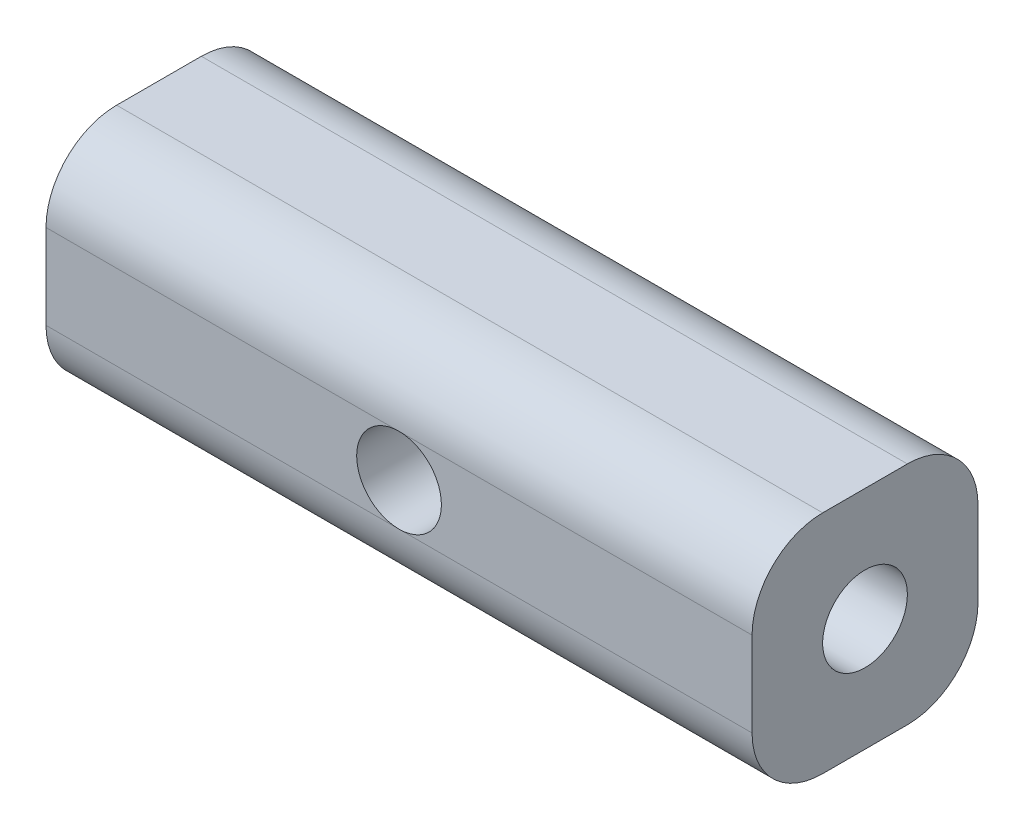
ISO-10303-21;
HEADER;
FILE_DESCRIPTION(('STEP AP214'),'2;1');
FILE_NAME('part.step','',(''),(''),'','','');
FILE_SCHEMA(('AUTOMOTIVE_DESIGN { 1 0 10303 214 1 1 1 1 }'));
ENDSEC;
DATA;
#1=APPLICATION_CONTEXT('core data for automotive mechanical design processes');
#2=APPLICATION_PROTOCOL_DEFINITION('international standard','automotive_design',2000,#1);
#3=PRODUCT_CONTEXT('',#1,'mechanical');
#4=PRODUCT('Part','Part','',(#3));
#5=PRODUCT_RELATED_PRODUCT_CATEGORY('part','',(#4));
#6=PRODUCT_DEFINITION_FORMATION('','',#4);
#7=PRODUCT_DEFINITION_CONTEXT('part definition',#1,'design');
#8=PRODUCT_DEFINITION('design','',#6,#7);
#9=PRODUCT_DEFINITION_SHAPE('','',#8);
#10=(LENGTH_UNIT() NAMED_UNIT(*) SI_UNIT(.MILLI.,.METRE.));
#11=(NAMED_UNIT(*) PLANE_ANGLE_UNIT() SI_UNIT($,.RADIAN.));
#12=(NAMED_UNIT(*) SI_UNIT($,.STERADIAN.) SOLID_ANGLE_UNIT());
#13=UNCERTAINTY_MEASURE_WITH_UNIT(LENGTH_MEASURE(1.E-05),#10,'distance_accuracy_value','');
#14=(GEOMETRIC_REPRESENTATION_CONTEXT(3) GLOBAL_UNCERTAINTY_ASSIGNED_CONTEXT((#13)) GLOBAL_UNIT_ASSIGNED_CONTEXT((#10,
#11,#12)) REPRESENTATION_CONTEXT('',''));
#15=CARTESIAN_POINT('',(0.,0.,0.));
#16=DIRECTION('',(0.,0.,1.));
#17=DIRECTION('',(1.,0.,0.));
#18=AXIS2_PLACEMENT_3D('',#15,#16,#17);
#19=CARTESIAN_POINT('',(0.,0.,80.));
#20=DIRECTION('',(0.,0.,-1.));
#21=DIRECTION('',(-1.,0.,0.));
#22=AXIS2_PLACEMENT_3D('',#19,#20,#21);
#23=PLANE('',#22);
#24=DIRECTION('',(0.,-1.,0.));
#25=VECTOR('',#24,1.);
#26=CARTESIAN_POINT('',(0.,0.,80.));
#27=LINE('',#26,#25);
#28=CARTESIAN_POINT('',(0.,55.,80.));
#29=VERTEX_POINT('',#28);
#30=CARTESIAN_POINT('',(0.,25.,80.));
#31=VERTEX_POINT('',#30);
#32=EDGE_CURVE('E191',#29,#31,#27,.T.);
#33=ORIENTED_EDGE('',*,*,#32,.T.);
#34=DIRECTION('',(1.,0.,0.));
#35=VECTOR('',#34,1.);
#36=CARTESIAN_POINT('',(0.,25.,80.));
#37=LINE('',#36,#35);
#38=CARTESIAN_POINT('',(125.,25.,80.));
#39=VERTEX_POINT('',#38);
#40=EDGE_CURVE('E11',#31,#39,#37,.T.);
#41=ORIENTED_EDGE('',*,*,#40,.T.);
#42=CARTESIAN_POINT('',(125.,40.,80.));
#43=DIRECTION('',(0.,0.,1.));
#44=DIRECTION('',(1.,0.,0.));
#45=AXIS2_PLACEMENT_3D('',#42,#43,#44);
#46=CIRCLE('',#45,15.);
#47=CARTESIAN_POINT('',(125.,55.,80.));
#48=VERTEX_POINT('',#47);
#49=EDGE_CURVE('E228',#48,#39,#46,.T.);
#50=ORIENTED_EDGE('',*,*,#49,.F.);
#51=DIRECTION('',(-1.,0.,0.));
#52=VECTOR('',#51,1.);
#53=CARTESIAN_POINT('',(0.,55.,80.));
#54=LINE('',#53,#52);
#55=EDGE_CURVE('E54',#48,#29,#54,.T.);
#56=ORIENTED_EDGE('',*,*,#55,.T.);
#57=EDGE_LOOP('',(#33,#41,#50,#56));
#58=FACE_BOUND('',#57,.T.);
#59=ADVANCED_FACE('F33',(#58),#23,.F.);
#60=CARTESIAN_POINT('',(0.,0.,0.));
#61=DIRECTION('',(0.,0.,-1.));
#62=DIRECTION('',(-1.,0.,0.));
#63=AXIS2_PLACEMENT_3D('',#60,#61,#62);
#64=PLANE('',#63);
#65=DIRECTION('',(0.,-1.,0.));
#66=VECTOR('',#65,1.);
#67=CARTESIAN_POINT('',(0.,0.,0.));
#68=LINE('',#67,#66);
#69=CARTESIAN_POINT('',(0.,55.,0.));
#70=VERTEX_POINT('',#69);
#71=CARTESIAN_POINT('',(0.,25.,0.));
#72=VERTEX_POINT('',#71);
#73=EDGE_CURVE('E218',#70,#72,#68,.T.);
#74=ORIENTED_EDGE('',*,*,#73,.F.);
#75=DIRECTION('',(-1.,0.,0.));
#76=VECTOR('',#75,1.);
#77=CARTESIAN_POINT('',(250.,55.,0.));
#78=LINE('',#77,#76);
#79=CARTESIAN_POINT('',(125.,55.,0.));
#80=VERTEX_POINT('',#79);
#81=EDGE_CURVE('E157',#70,#80,#78,.F.);
#82=ORIENTED_EDGE('',*,*,#81,.T.);
#83=CARTESIAN_POINT('',(125.,40.,0.));
#84=DIRECTION('',(0.,0.,1.));
#85=DIRECTION('',(1.,0.,0.));
#86=AXIS2_PLACEMENT_3D('',#83,#84,#85);
#87=CIRCLE('',#86,15.);
#88=CARTESIAN_POINT('',(125.,25.,0.));
#89=VERTEX_POINT('',#88);
#90=EDGE_CURVE('E225',#80,#89,#87,.T.);
#91=ORIENTED_EDGE('',*,*,#90,.T.);
#92=DIRECTION('',(1.,0.,0.));
#93=VECTOR('',#92,1.);
#94=CARTESIAN_POINT('',(0.,25.,0.));
#95=LINE('',#94,#93);
#96=EDGE_CURVE('E151',#89,#72,#95,.F.);
#97=ORIENTED_EDGE('',*,*,#96,.T.);
#98=EDGE_LOOP('',(#74,#82,#91,#97));
#99=FACE_BOUND('',#98,.T.);
#100=ADVANCED_FACE('F256',(#99),#64,.T.);
#101=CARTESIAN_POINT('',(0.,40.,40.));
#102=DIRECTION('',(1.,0.,0.));
#103=DIRECTION('',(0.,0.,-1.));
#104=AXIS2_PLACEMENT_3D('',#101,#102,#103);
#105=CYLINDRICAL_SURFACE('',#104,15.);
#106=CARTESIAN_POINT('',(250.,40.,40.));
#107=DIRECTION('',(1.,0.,0.));
#108=DIRECTION('',(0.,0.,-1.));
#109=AXIS2_PLACEMENT_3D('',#106,#107,#108);
#110=CIRCLE('',#109,15.);
#111=CARTESIAN_POINT('',(250.,40.,25.));
#112=VERTEX_POINT('',#111);
#113=EDGE_CURVE('E222',#112,#112,#110,.T.);
#114=ORIENTED_EDGE('',*,*,#113,.T.);
#115=EDGE_LOOP('',(#114));
#116=FACE_BOUND('',#115,.T.);
#117=CARTESIAN_POINT('',(125.,40.,40.));
#118=DIRECTION('',(0.707106781186547,0.,-0.707106781186547));
#119=DIRECTION('',(0.707106781186547,0.,0.707106781186547));
#120=AXIS2_PLACEMENT_3D('',#117,#118,#119);
#121=ELLIPSE('',#120,21.2132034355964,15.);
#122=CARTESIAN_POINT('',(125.,25.,40.));
#123=VERTEX_POINT('',#122);
#124=CARTESIAN_POINT('',(125.,55.,40.));
#125=VERTEX_POINT('',#124);
#126=EDGE_CURVE('E124',#123,#125,#121,.F.);
#127=ORIENTED_EDGE('',*,*,#126,.T.);
#128=CARTESIAN_POINT('',(125.,40.,40.));
#129=DIRECTION('',(0.707106781186547,0.,0.707106781186547));
#130=DIRECTION('',(0.707106781186547,0.,-0.707106781186547));
#131=AXIS2_PLACEMENT_3D('',#128,#129,#130);
#132=ELLIPSE('',#131,21.2132034355964,15.);
#133=EDGE_CURVE('E120',#125,#123,#132,.F.);
#134=ORIENTED_EDGE('',*,*,#133,.T.);
#135=EDGE_LOOP('',(#127,#134));
#136=FACE_BOUND('',#135,.T.);
#137=ADVANCED_FACE('F132',(#116,#136),#105,.F.);
#138=CARTESIAN_POINT('',(0.,0.,80.));
#139=DIRECTION('',(1.,0.,0.));
#140=DIRECTION('',(0.,0.,-1.));
#141=AXIS2_PLACEMENT_3D('',#138,#139,#140);
#142=PLANE('',#141);
#143=CARTESIAN_POINT('',(0.,40.,40.));
#144=DIRECTION('',(1.,0.,0.));
#145=DIRECTION('',(0.,0.,-1.));
#146=AXIS2_PLACEMENT_3D('',#143,#144,#145);
#147=CIRCLE('',#146,15.);
#148=CARTESIAN_POINT('',(0.,40.,25.));
#149=VERTEX_POINT('',#148);
#150=EDGE_CURVE('E219',#149,#149,#147,.T.);
#151=ORIENTED_EDGE('',*,*,#150,.T.);
#152=EDGE_LOOP('',(#151));
#153=FACE_BOUND('',#152,.T.);
#154=DIRECTION('',(0.,0.,-1.));
#155=VECTOR('',#154,1.);
#156=CARTESIAN_POINT('',(0.,80.,80.));
#157=LINE('',#156,#155);
#158=CARTESIAN_POINT('',(0.,80.,55.));
#159=VERTEX_POINT('',#158);
#160=CARTESIAN_POINT('',(0.,80.,25.));
#161=VERTEX_POINT('',#160);
#162=EDGE_CURVE('E190',#159,#161,#157,.T.);
#163=ORIENTED_EDGE('',*,*,#162,.T.);
#164=CARTESIAN_POINT('',(0.,55.,25.));
#165=DIRECTION('',(1.,0.,0.));
#166=DIRECTION('',(0.,0.,-1.));
#167=AXIS2_PLACEMENT_3D('',#164,#165,#166);
#168=CIRCLE('',#167,25.);
#169=EDGE_CURVE('E149',#161,#70,#168,.F.);
#170=ORIENTED_EDGE('',*,*,#169,.T.);
#171=ORIENTED_EDGE('',*,*,#73,.T.);
#172=CARTESIAN_POINT('',(0.,25.,25.));
#173=DIRECTION('',(1.,0.,0.));
#174=DIRECTION('',(0.,0.,-1.));
#175=AXIS2_PLACEMENT_3D('',#172,#173,#174);
#176=CIRCLE('',#175,25.);
#177=CARTESIAN_POINT('',(0.,0.,25.));
#178=VERTEX_POINT('',#177);
#179=EDGE_CURVE('E147',#72,#178,#176,.F.);
#180=ORIENTED_EDGE('',*,*,#179,.T.);
#181=DIRECTION('',(0.,0.,-1.));
#182=VECTOR('',#181,1.);
#183=CARTESIAN_POINT('',(0.,0.,80.));
#184=LINE('',#183,#182);
#185=CARTESIAN_POINT('',(0.,0.,55.));
#186=VERTEX_POINT('',#185);
#187=EDGE_CURVE('E130',#186,#178,#184,.T.);
#188=ORIENTED_EDGE('',*,*,#187,.F.);
#189=CARTESIAN_POINT('',(0.,25.,55.));
#190=DIRECTION('',(1.,0.,0.));
#191=DIRECTION('',(0.,0.,-1.));
#192=AXIS2_PLACEMENT_3D('',#189,#190,#191);
#193=CIRCLE('',#192,25.);
#194=EDGE_CURVE('E145',#186,#31,#193,.F.);
#195=ORIENTED_EDGE('',*,*,#194,.T.);
#196=ORIENTED_EDGE('',*,*,#32,.F.);
#197=CARTESIAN_POINT('',(0.,55.,55.));
#198=DIRECTION('',(1.,0.,0.));
#199=DIRECTION('',(0.,0.,-1.));
#200=AXIS2_PLACEMENT_3D('',#197,#198,#199);
#201=CIRCLE('',#200,25.);
#202=EDGE_CURVE('E143',#29,#159,#201,.F.);
#203=ORIENTED_EDGE('',*,*,#202,.T.);
#204=EDGE_LOOP('',(#163,#170,#171,#180,#188,#195,#196,#203));
#205=FACE_BOUND('',#204,.T.);
#206=ADVANCED_FACE('F204',(#153,#205),#142,.F.);
#207=CARTESIAN_POINT('',(0.,0.,80.));
#208=DIRECTION('',(0.,1.,0.));
#209=DIRECTION('',(0.,0.,1.));
#210=AXIS2_PLACEMENT_3D('',#207,#208,#209);
#211=PLANE('',#210);
#212=ORIENTED_EDGE('',*,*,#187,.T.);
#213=DIRECTION('',(1.,0.,0.));
#214=VECTOR('',#213,1.);
#215=CARTESIAN_POINT('',(250.,0.,25.));
#216=LINE('',#215,#214);
#217=CARTESIAN_POINT('',(250.,0.,25.));
#218=VERTEX_POINT('',#217);
#219=EDGE_CURVE('E169',#178,#218,#216,.T.);
#220=ORIENTED_EDGE('',*,*,#219,.T.);
#221=DIRECTION('',(0.,0.,-1.));
#222=VECTOR('',#221,1.);
#223=CARTESIAN_POINT('',(250.,0.,80.));
#224=LINE('',#223,#222);
#225=CARTESIAN_POINT('',(250.,0.,55.));
#226=VERTEX_POINT('',#225);
#227=EDGE_CURVE('E201',#226,#218,#224,.T.);
#228=ORIENTED_EDGE('',*,*,#227,.F.);
#229=DIRECTION('',(1.,0.,0.));
#230=VECTOR('',#229,1.);
#231=CARTESIAN_POINT('',(0.,0.,55.));
#232=LINE('',#231,#230);
#233=EDGE_CURVE('E167',#226,#186,#232,.F.);
#234=ORIENTED_EDGE('',*,*,#233,.T.);
#235=EDGE_LOOP('',(#212,#220,#228,#234));
#236=FACE_BOUND('',#235,.T.);
#237=ADVANCED_FACE('F199',(#236),#211,.F.);
#238=CARTESIAN_POINT('',(250.,0.,80.));
#239=DIRECTION('',(-1.,0.,0.));
#240=DIRECTION('',(0.,0.,1.));
#241=AXIS2_PLACEMENT_3D('',#238,#239,#240);
#242=PLANE('',#241);
#243=ORIENTED_EDGE('',*,*,#113,.F.);
#244=EDGE_LOOP('',(#243));
#245=FACE_BOUND('',#244,.T.);
#246=DIRECTION('',(0.,1.,0.));
#247=VECTOR('',#246,1.);
#248=CARTESIAN_POINT('',(250.,0.,0.));
#249=LINE('',#248,#247);
#250=CARTESIAN_POINT('',(250.,25.,0.));
#251=VERTEX_POINT('',#250);
#252=CARTESIAN_POINT('',(250.,55.,0.));
#253=VERTEX_POINT('',#252);
#254=EDGE_CURVE('E216',#251,#253,#249,.T.);
#255=ORIENTED_EDGE('',*,*,#254,.T.);
#256=CARTESIAN_POINT('',(250.,55.,25.));
#257=DIRECTION('',(-1.,0.,0.));
#258=DIRECTION('',(0.,0.,1.));
#259=AXIS2_PLACEMENT_3D('',#256,#257,#258);
#260=CIRCLE('',#259,25.);
#261=CARTESIAN_POINT('',(250.,80.,25.));
#262=VERTEX_POINT('',#261);
#263=EDGE_CURVE('E165',#253,#262,#260,.F.);
#264=ORIENTED_EDGE('',*,*,#263,.T.);
#265=DIRECTION('',(0.,0.,-1.));
#266=VECTOR('',#265,1.);
#267=CARTESIAN_POINT('',(250.,80.,80.));
#268=LINE('',#267,#266);
#269=CARTESIAN_POINT('',(250.,80.,55.));
#270=VERTEX_POINT('',#269);
#271=EDGE_CURVE('E210',#270,#262,#268,.T.);
#272=ORIENTED_EDGE('',*,*,#271,.F.);
#273=CARTESIAN_POINT('',(250.,55.,55.));
#274=DIRECTION('',(-1.,0.,0.));
#275=DIRECTION('',(0.,0.,1.));
#276=AXIS2_PLACEMENT_3D('',#273,#274,#275);
#277=CIRCLE('',#276,25.);
#278=CARTESIAN_POINT('',(250.,55.,80.));
#279=VERTEX_POINT('',#278);
#280=EDGE_CURVE('E159',#270,#279,#277,.F.);
#281=ORIENTED_EDGE('',*,*,#280,.T.);
#282=DIRECTION('',(0.,1.,0.));
#283=VECTOR('',#282,1.);
#284=CARTESIAN_POINT('',(250.,0.,80.));
#285=LINE('',#284,#283);
#286=CARTESIAN_POINT('',(250.,25.,80.));
#287=VERTEX_POINT('',#286);
#288=EDGE_CURVE('E179',#287,#279,#285,.T.);
#289=ORIENTED_EDGE('',*,*,#288,.F.);
#290=CARTESIAN_POINT('',(250.,25.,55.));
#291=DIRECTION('',(-1.,0.,0.));
#292=DIRECTION('',(0.,0.,1.));
#293=AXIS2_PLACEMENT_3D('',#290,#291,#292);
#294=CIRCLE('',#293,25.);
#295=EDGE_CURVE('E161',#287,#226,#294,.F.);
#296=ORIENTED_EDGE('',*,*,#295,.T.);
#297=ORIENTED_EDGE('',*,*,#227,.T.);
#298=CARTESIAN_POINT('',(250.,25.,25.));
#299=DIRECTION('',(-1.,0.,0.));
#300=DIRECTION('',(0.,0.,1.));
#301=AXIS2_PLACEMENT_3D('',#298,#299,#300);
#302=CIRCLE('',#301,25.);
#303=EDGE_CURVE('E163',#218,#251,#302,.F.);
#304=ORIENTED_EDGE('',*,*,#303,.T.);
#305=EDGE_LOOP('',(#255,#264,#272,#281,#289,#296,#297,#304));
#306=FACE_BOUND('',#305,.T.);
#307=ADVANCED_FACE('F185',(#245,#306),#242,.F.);
#308=CARTESIAN_POINT('',(0.,80.,80.));
#309=DIRECTION('',(0.,-1.,0.));
#310=DIRECTION('',(0.,0.,-1.));
#311=AXIS2_PLACEMENT_3D('',#308,#309,#310);
#312=PLANE('',#311);
#313=ORIENTED_EDGE('',*,*,#271,.T.);
#314=DIRECTION('',(-1.,0.,0.));
#315=VECTOR('',#314,1.);
#316=CARTESIAN_POINT('',(0.,80.,25.));
#317=LINE('',#316,#315);
#318=EDGE_CURVE('E140',#262,#161,#317,.T.);
#319=ORIENTED_EDGE('',*,*,#318,.T.);
#320=ORIENTED_EDGE('',*,*,#162,.F.);
#321=DIRECTION('',(-1.,0.,0.));
#322=VECTOR('',#321,1.);
#323=CARTESIAN_POINT('',(0.,80.,55.));
#324=LINE('',#323,#322);
#325=EDGE_CURVE('E133',#159,#270,#324,.F.);
#326=ORIENTED_EDGE('',*,*,#325,.T.);
#327=EDGE_LOOP('',(#313,#319,#320,#326));
#328=FACE_BOUND('',#327,.T.);
#329=ADVANCED_FACE('F249',(#328),#312,.F.);
#330=EDGE_CURVE('E181',#39,#48,#46,.T.);
#331=ORIENTED_EDGE('',*,*,#330,.F.);
#332=DIRECTION('',(1.,0.,0.));
#333=VECTOR('',#332,1.);
#334=CARTESIAN_POINT('',(0.,25.,80.));
#335=LINE('',#334,#333);
#336=EDGE_CURVE('E41',#39,#287,#335,.T.);
#337=ORIENTED_EDGE('',*,*,#336,.T.);
#338=ORIENTED_EDGE('',*,*,#288,.T.);
#339=DIRECTION('',(-1.,0.,0.));
#340=VECTOR('',#339,1.);
#341=CARTESIAN_POINT('',(0.,55.,80.));
#342=LINE('',#341,#340);
#343=EDGE_CURVE('E173',#279,#48,#342,.T.);
#344=ORIENTED_EDGE('',*,*,#343,.T.);
#345=EDGE_LOOP('',(#331,#337,#338,#344));
#346=FACE_BOUND('',#345,.T.);
#347=ADVANCED_FACE('F178',(#346),#23,.F.);
#348=EDGE_CURVE('E230',#89,#80,#87,.T.);
#349=ORIENTED_EDGE('',*,*,#348,.T.);
#350=DIRECTION('',(-1.,0.,0.));
#351=VECTOR('',#350,1.);
#352=CARTESIAN_POINT('',(250.,55.,0.));
#353=LINE('',#352,#351);
#354=EDGE_CURVE('E155',#80,#253,#353,.F.);
#355=ORIENTED_EDGE('',*,*,#354,.T.);
#356=ORIENTED_EDGE('',*,*,#254,.F.);
#357=DIRECTION('',(1.,0.,0.));
#358=VECTOR('',#357,1.);
#359=CARTESIAN_POINT('',(0.,25.,0.));
#360=LINE('',#359,#358);
#361=EDGE_CURVE('E153',#251,#89,#360,.F.);
#362=ORIENTED_EDGE('',*,*,#361,.T.);
#363=EDGE_LOOP('',(#349,#355,#356,#362));
#364=FACE_BOUND('',#363,.T.);
#365=ADVANCED_FACE('F238',(#364),#64,.T.);
#366=CARTESIAN_POINT('',(125.,40.,40.));
#367=DIRECTION('',(0.707106781186547,0.,-0.707106781186547));
#368=DIRECTION('',(0.707106781186547,0.,0.707106781186547));
#369=AXIS2_PLACEMENT_3D('',#366,#367,#368);
#370=ELLIPSE('',#369,21.2132034355964,15.);
#371=EDGE_CURVE('E116',#123,#125,#370,.T.);
#372=ORIENTED_EDGE('',*,*,#371,.T.);
#373=CARTESIAN_POINT('',(125.,40.,40.));
#374=DIRECTION('',(0.707106781186547,0.,0.707106781186547));
#375=DIRECTION('',(0.707106781186547,0.,-0.707106781186547));
#376=AXIS2_PLACEMENT_3D('',#373,#374,#375);
#377=ELLIPSE('',#376,21.2132034355964,15.);
#378=EDGE_CURVE('E123',#125,#123,#377,.T.);
#379=ORIENTED_EDGE('',*,*,#378,.T.);
#380=EDGE_LOOP('',(#372,#379));
#381=FACE_BOUND('',#380,.T.);
#382=ORIENTED_EDGE('',*,*,#150,.F.);
#383=EDGE_LOOP('',(#382));
#384=FACE_BOUND('',#383,.T.);
#385=ADVANCED_FACE('F135',(#381,#384),#105,.F.);
#386=CARTESIAN_POINT('',(125.,40.,0.));
#387=DIRECTION('',(0.,0.,1.));
#388=DIRECTION('',(1.,0.,0.));
#389=AXIS2_PLACEMENT_3D('',#386,#387,#388);
#390=CYLINDRICAL_SURFACE('',#389,15.);
#391=ORIENTED_EDGE('',*,*,#49,.T.);
#392=ORIENTED_EDGE('',*,*,#330,.T.);
#393=EDGE_LOOP('',(#391,#392));
#394=FACE_BOUND('',#393,.T.);
#395=ORIENTED_EDGE('',*,*,#126,.F.);
#396=ORIENTED_EDGE('',*,*,#378,.F.);
#397=EDGE_LOOP('',(#395,#396));
#398=FACE_BOUND('',#397,.T.);
#399=ADVANCED_FACE('F128',(#394,#398),#390,.F.);
#400=ORIENTED_EDGE('',*,*,#90,.F.);
#401=ORIENTED_EDGE('',*,*,#348,.F.);
#402=EDGE_LOOP('',(#400,#401));
#403=FACE_BOUND('',#402,.T.);
#404=ORIENTED_EDGE('',*,*,#371,.F.);
#405=ORIENTED_EDGE('',*,*,#133,.F.);
#406=EDGE_LOOP('',(#404,#405));
#407=FACE_BOUND('',#406,.T.);
#408=ADVANCED_FACE('F118',(#403,#407),#390,.F.);
#409=CARTESIAN_POINT('',(0.,55.,25.));
#410=DIRECTION('',(1.,0.,0.));
#411=DIRECTION('',(0.,0.,-1.));
#412=AXIS2_PLACEMENT_3D('',#409,#410,#411);
#413=CYLINDRICAL_SURFACE('',#412,25.);
#414=ORIENTED_EDGE('',*,*,#354,.F.);
#415=ORIENTED_EDGE('',*,*,#81,.F.);
#416=ORIENTED_EDGE('',*,*,#169,.F.);
#417=ORIENTED_EDGE('',*,*,#318,.F.);
#418=ORIENTED_EDGE('',*,*,#263,.F.);
#419=EDGE_LOOP('',(#414,#415,#416,#417,#418));
#420=FACE_BOUND('',#419,.T.);
#421=ADVANCED_FACE('F246',(#420),#413,.T.);
#422=CARTESIAN_POINT('',(0.,25.,25.));
#423=DIRECTION('',(-1.,0.,0.));
#424=DIRECTION('',(0.,0.,1.));
#425=AXIS2_PLACEMENT_3D('',#422,#423,#424);
#426=CYLINDRICAL_SURFACE('',#425,25.);
#427=ORIENTED_EDGE('',*,*,#96,.F.);
#428=ORIENTED_EDGE('',*,*,#361,.F.);
#429=ORIENTED_EDGE('',*,*,#303,.F.);
#430=ORIENTED_EDGE('',*,*,#219,.F.);
#431=ORIENTED_EDGE('',*,*,#179,.F.);
#432=EDGE_LOOP('',(#427,#428,#429,#430,#431));
#433=FACE_BOUND('',#432,.T.);
#434=ADVANCED_FACE('F258',(#433),#426,.T.);
#435=CARTESIAN_POINT('',(0.,25.,55.));
#436=DIRECTION('',(1.,0.,0.));
#437=DIRECTION('',(0.,0.,-1.));
#438=AXIS2_PLACEMENT_3D('',#435,#436,#437);
#439=CYLINDRICAL_SURFACE('',#438,25.);
#440=ORIENTED_EDGE('',*,*,#194,.F.);
#441=ORIENTED_EDGE('',*,*,#233,.F.);
#442=ORIENTED_EDGE('',*,*,#295,.F.);
#443=ORIENTED_EDGE('',*,*,#336,.F.);
#444=ORIENTED_EDGE('',*,*,#40,.F.);
#445=EDGE_LOOP('',(#440,#441,#442,#443,#444));
#446=FACE_BOUND('',#445,.T.);
#447=ADVANCED_FACE('F195',(#446),#439,.T.);
#448=CARTESIAN_POINT('',(0.,55.,55.));
#449=DIRECTION('',(-1.,0.,0.));
#450=DIRECTION('',(0.,0.,1.));
#451=AXIS2_PLACEMENT_3D('',#448,#449,#450);
#452=CYLINDRICAL_SURFACE('',#451,25.);
#453=ORIENTED_EDGE('',*,*,#280,.F.);
#454=ORIENTED_EDGE('',*,*,#325,.F.);
#455=ORIENTED_EDGE('',*,*,#202,.F.);
#456=ORIENTED_EDGE('',*,*,#55,.F.);
#457=ORIENTED_EDGE('',*,*,#343,.F.);
#458=EDGE_LOOP('',(#453,#454,#455,#456,#457));
#459=FACE_BOUND('',#458,.T.);
#460=ADVANCED_FACE('F35',(#459),#452,.T.);
#461=CLOSED_SHELL('',(#59,#100,#137,#206,#237,#307,#329,#347,#365,#385,#399,#408,#421,#434,#447,#460));
#462=MANIFOLD_SOLID_BREP('B2',#461);
#463=ADVANCED_BREP_SHAPE_REPRESENTATION('',(#18,#462),#14);
#464=SHAPE_DEFINITION_REPRESENTATION(#9,#463);
ENDSEC;
END-ISO-10303-21;
